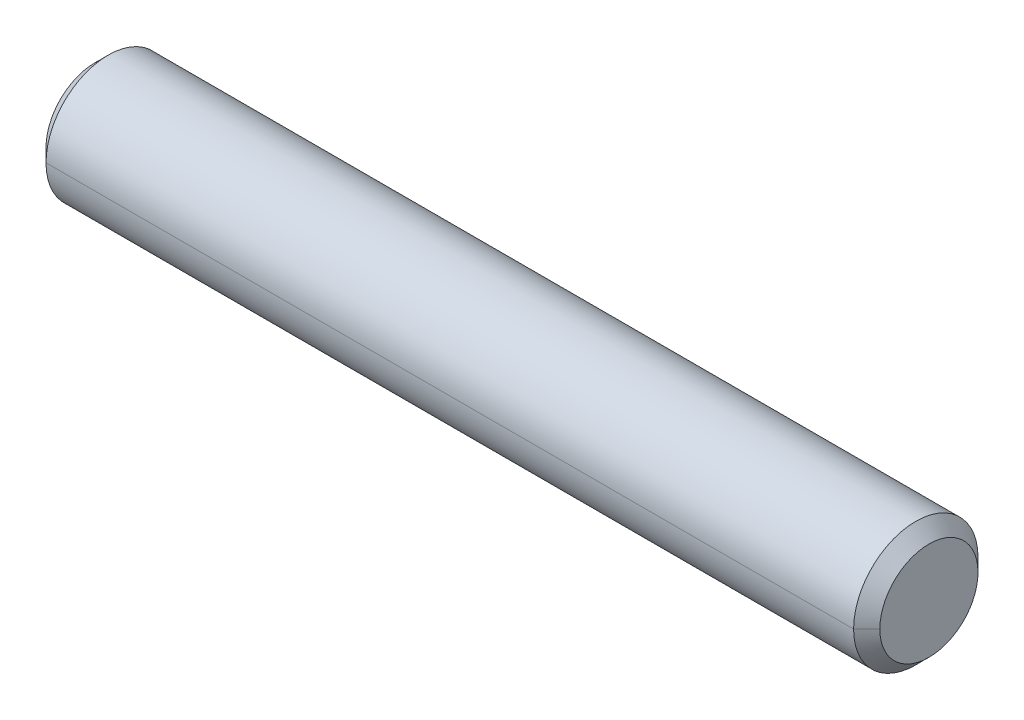
ISO-10303-21;
HEADER;
FILE_DESCRIPTION(('STEP AP214'),'2;1');
FILE_NAME('part.step','',(''),(''),'','','');
FILE_SCHEMA(('AUTOMOTIVE_DESIGN { 1 0 10303 214 1 1 1 1 }'));
ENDSEC;
DATA;
#1=APPLICATION_CONTEXT('core data for automotive mechanical design processes');
#2=APPLICATION_PROTOCOL_DEFINITION('international standard','automotive_design',2000,#1);
#3=PRODUCT_CONTEXT('',#1,'mechanical');
#4=PRODUCT('Part','Part','',(#3));
#5=PRODUCT_RELATED_PRODUCT_CATEGORY('part','',(#4));
#6=PRODUCT_DEFINITION_FORMATION('','',#4);
#7=PRODUCT_DEFINITION_CONTEXT('part definition',#1,'design');
#8=PRODUCT_DEFINITION('design','',#6,#7);
#9=PRODUCT_DEFINITION_SHAPE('','',#8);
#10=(LENGTH_UNIT() NAMED_UNIT(*) SI_UNIT(.MILLI.,.METRE.));
#11=(NAMED_UNIT(*) PLANE_ANGLE_UNIT() SI_UNIT($,.RADIAN.));
#12=(NAMED_UNIT(*) SI_UNIT($,.STERADIAN.) SOLID_ANGLE_UNIT());
#13=UNCERTAINTY_MEASURE_WITH_UNIT(LENGTH_MEASURE(1.E-05),#10,'distance_accuracy_value','');
#14=(GEOMETRIC_REPRESENTATION_CONTEXT(3) GLOBAL_UNCERTAINTY_ASSIGNED_CONTEXT((#13)) GLOBAL_UNIT_ASSIGNED_CONTEXT((#10,
#11,#12)) REPRESENTATION_CONTEXT('',''));
#15=CARTESIAN_POINT('',(0.,0.,0.));
#16=DIRECTION('',(0.,0.,1.));
#17=DIRECTION('',(1.,0.,0.));
#18=AXIS2_PLACEMENT_3D('',#15,#16,#17);
#19=CARTESIAN_POINT('',(15.875,0.,0.));
#20=DIRECTION('',(-1.,0.,0.));
#21=DIRECTION('',(0.,0.,1.));
#22=AXIS2_PLACEMENT_3D('',#19,#20,#21);
#23=CONICAL_SURFACE('',#22,1.86855,0.785398163397448);
#24=DIRECTION('',(-0.707106781186548,0.,-0.707106781186547));
#25=VECTOR('',#24,1.);
#26=CARTESIAN_POINT('',(15.875,0.,-1.86855));
#27=LINE('',#26,#25);
#28=CARTESIAN_POINT('',(15.875,0.,-1.86855));
#29=VERTEX_POINT('',#28);
#30=CARTESIAN_POINT('',(15.375,0.,-2.36855));
#31=VERTEX_POINT('',#30);
#32=EDGE_CURVE('E76',#29,#31,#27,.T.);
#33=ORIENTED_EDGE('',*,*,#32,.F.);
#34=CARTESIAN_POINT('',(15.875,0.,0.));
#35=DIRECTION('',(1.,0.,0.));
#36=DIRECTION('',(0.,0.,-1.));
#37=AXIS2_PLACEMENT_3D('',#34,#35,#36);
#38=CIRCLE('',#37,1.86855);
#39=CARTESIAN_POINT('',(15.875,0.,1.86855));
#40=VERTEX_POINT('',#39);
#41=EDGE_CURVE('E27',#40,#29,#38,.T.);
#42=ORIENTED_EDGE('',*,*,#41,.F.);
#43=DIRECTION('',(-0.707106781186548,0.,0.707106781186547));
#44=VECTOR('',#43,1.);
#45=CARTESIAN_POINT('',(15.875,0.,1.86855));
#46=LINE('',#45,#44);
#47=CARTESIAN_POINT('',(15.375,0.,2.36855));
#48=VERTEX_POINT('',#47);
#49=EDGE_CURVE('E20',#40,#48,#46,.T.);
#50=ORIENTED_EDGE('',*,*,#49,.T.);
#51=CARTESIAN_POINT('',(15.375,0.,0.));
#52=DIRECTION('',(-1.,0.,0.));
#53=DIRECTION('',(0.,0.,-1.));
#54=AXIS2_PLACEMENT_3D('',#51,#52,#53);
#55=CIRCLE('',#54,2.36855);
#56=EDGE_CURVE('E67',#31,#48,#55,.T.);
#57=ORIENTED_EDGE('',*,*,#56,.F.);
#58=EDGE_LOOP('',(#33,#42,#50,#57));
#59=FACE_BOUND('',#58,.T.);
#60=ADVANCED_FACE('F16',(#59),#23,.T.);
#61=CARTESIAN_POINT('',(-15.375,0.,0.));
#62=DIRECTION('',(1.,0.,0.));
#63=DIRECTION('',(0.,0.,-1.));
#64=AXIS2_PLACEMENT_3D('',#61,#62,#63);
#65=CONICAL_SURFACE('',#64,2.36855,0.785398163397455);
#66=DIRECTION('',(0.707106781186543,0.,0.707106781186552));
#67=VECTOR('',#66,1.);
#68=CARTESIAN_POINT('',(-15.375,0.,2.36855));
#69=LINE('',#68,#67);
#70=CARTESIAN_POINT('',(-15.875,0.,1.86855));
#71=VERTEX_POINT('',#70);
#72=CARTESIAN_POINT('',(-15.375,0.,2.36855));
#73=VERTEX_POINT('',#72);
#74=EDGE_CURVE('E108',#71,#73,#69,.T.);
#75=ORIENTED_EDGE('',*,*,#74,.F.);
#76=CARTESIAN_POINT('',(-15.875,0.,0.));
#77=DIRECTION('',(-1.,0.,0.));
#78=DIRECTION('',(0.,0.,-1.));
#79=AXIS2_PLACEMENT_3D('',#76,#77,#78);
#80=CIRCLE('',#79,1.86855);
#81=CARTESIAN_POINT('',(-15.875,0.,-1.86855));
#82=VERTEX_POINT('',#81);
#83=EDGE_CURVE('E11',#82,#71,#80,.T.);
#84=ORIENTED_EDGE('',*,*,#83,.F.);
#85=DIRECTION('',(0.707106781186543,0.,-0.707106781186552));
#86=VECTOR('',#85,1.);
#87=CARTESIAN_POINT('',(-15.375,0.,-2.36855));
#88=LINE('',#87,#86);
#89=CARTESIAN_POINT('',(-15.375,0.,-2.36855));
#90=VERTEX_POINT('',#89);
#91=EDGE_CURVE('E90',#82,#90,#88,.T.);
#92=ORIENTED_EDGE('',*,*,#91,.T.);
#93=CARTESIAN_POINT('',(-15.375,0.,0.));
#94=DIRECTION('',(1.,0.,0.));
#95=DIRECTION('',(0.,0.,-1.));
#96=AXIS2_PLACEMENT_3D('',#93,#94,#95);
#97=CIRCLE('',#96,2.36855);
#98=EDGE_CURVE('E41',#73,#90,#97,.T.);
#99=ORIENTED_EDGE('',*,*,#98,.F.);
#100=EDGE_LOOP('',(#75,#84,#92,#99));
#101=FACE_BOUND('',#100,.T.);
#102=ADVANCED_FACE('F133',(#101),#65,.T.);
#103=CARTESIAN_POINT('',(-15.875,0.,0.));
#104=DIRECTION('',(1.,0.,0.));
#105=DIRECTION('',(0.,1.,0.));
#106=AXIS2_PLACEMENT_3D('',#103,#104,#105);
#107=PLANE('',#106);
#108=ORIENTED_EDGE('',*,*,#83,.T.);
#109=CARTESIAN_POINT('',(-15.875,0.,0.));
#110=DIRECTION('',(-1.,0.,0.));
#111=DIRECTION('',(0.,0.,-1.));
#112=AXIS2_PLACEMENT_3D('',#109,#110,#111);
#113=CIRCLE('',#112,1.86855);
#114=EDGE_CURVE('E111',#71,#82,#113,.T.);
#115=ORIENTED_EDGE('',*,*,#114,.T.);
#116=EDGE_LOOP('',(#108,#115));
#117=FACE_BOUND('',#116,.T.);
#118=ADVANCED_FACE('F135',(#117),#107,.F.);
#119=CARTESIAN_POINT('',(15.875,0.,0.));
#120=DIRECTION('',(1.,0.,0.));
#121=DIRECTION('',(0.,1.,0.));
#122=AXIS2_PLACEMENT_3D('',#119,#120,#121);
#123=PLANE('',#122);
#124=ORIENTED_EDGE('',*,*,#41,.T.);
#125=CARTESIAN_POINT('',(15.875,0.,0.));
#126=DIRECTION('',(1.,0.,0.));
#127=DIRECTION('',(0.,0.,-1.));
#128=AXIS2_PLACEMENT_3D('',#125,#126,#127);
#129=CIRCLE('',#128,1.86855);
#130=EDGE_CURVE('E99',#29,#40,#129,.T.);
#131=ORIENTED_EDGE('',*,*,#130,.T.);
#132=EDGE_LOOP('',(#124,#131));
#133=FACE_BOUND('',#132,.T.);
#134=ADVANCED_FACE('F137',(#133),#123,.T.);
#135=CARTESIAN_POINT('',(15.875,0.,0.));
#136=DIRECTION('',(-1.,0.,0.));
#137=DIRECTION('',(0.,0.,1.));
#138=AXIS2_PLACEMENT_3D('',#135,#136,#137);
#139=CYLINDRICAL_SURFACE('',#138,2.36855);
#140=DIRECTION('',(-1.,0.,0.));
#141=VECTOR('',#140,1.);
#142=CARTESIAN_POINT('',(15.875,0.,-2.36855));
#143=LINE('',#142,#141);
#144=EDGE_CURVE('E83',#31,#90,#143,.T.);
#145=ORIENTED_EDGE('',*,*,#144,.F.);
#146=ORIENTED_EDGE('',*,*,#56,.T.);
#147=DIRECTION('',(-1.,0.,0.));
#148=VECTOR('',#147,1.);
#149=CARTESIAN_POINT('',(15.875,0.,2.36855));
#150=LINE('',#149,#148);
#151=EDGE_CURVE('E81',#48,#73,#150,.T.);
#152=ORIENTED_EDGE('',*,*,#151,.T.);
#153=ORIENTED_EDGE('',*,*,#98,.T.);
#154=EDGE_LOOP('',(#145,#146,#152,#153));
#155=FACE_BOUND('',#154,.T.);
#156=ADVANCED_FACE('F85',(#155),#139,.T.);
#157=CARTESIAN_POINT('',(15.875,0.,0.));
#158=DIRECTION('',(-1.,0.,0.));
#159=DIRECTION('',(0.,0.,1.));
#160=AXIS2_PLACEMENT_3D('',#157,#158,#159);
#161=CYLINDRICAL_SURFACE('',#160,2.36855);
#162=CARTESIAN_POINT('',(15.375,0.,0.));
#163=DIRECTION('',(-1.,0.,0.));
#164=DIRECTION('',(0.,0.,-1.));
#165=AXIS2_PLACEMENT_3D('',#162,#163,#164);
#166=CIRCLE('',#165,2.36855);
#167=EDGE_CURVE('E92',#48,#31,#166,.T.);
#168=ORIENTED_EDGE('',*,*,#167,.T.);
#169=ORIENTED_EDGE('',*,*,#144,.T.);
#170=CARTESIAN_POINT('',(-15.375,0.,0.));
#171=DIRECTION('',(1.,0.,0.));
#172=DIRECTION('',(0.,0.,-1.));
#173=AXIS2_PLACEMENT_3D('',#170,#171,#172);
#174=CIRCLE('',#173,2.36855);
#175=EDGE_CURVE('E110',#90,#73,#174,.T.);
#176=ORIENTED_EDGE('',*,*,#175,.T.);
#177=ORIENTED_EDGE('',*,*,#151,.F.);
#178=EDGE_LOOP('',(#168,#169,#176,#177));
#179=FACE_BOUND('',#178,.T.);
#180=ADVANCED_FACE('F93',(#179),#161,.T.);
#181=CARTESIAN_POINT('',(-15.375,0.,0.));
#182=DIRECTION('',(1.,0.,0.));
#183=DIRECTION('',(0.,0.,-1.));
#184=AXIS2_PLACEMENT_3D('',#181,#182,#183);
#185=CONICAL_SURFACE('',#184,2.36855,0.785398163397455);
#186=ORIENTED_EDGE('',*,*,#114,.F.);
#187=ORIENTED_EDGE('',*,*,#74,.T.);
#188=ORIENTED_EDGE('',*,*,#175,.F.);
#189=ORIENTED_EDGE('',*,*,#91,.F.);
#190=EDGE_LOOP('',(#186,#187,#188,#189));
#191=FACE_BOUND('',#190,.T.);
#192=ADVANCED_FACE('F18',(#191),#185,.T.);
#193=CARTESIAN_POINT('',(15.875,0.,0.));
#194=DIRECTION('',(-1.,0.,0.));
#195=DIRECTION('',(0.,0.,1.));
#196=AXIS2_PLACEMENT_3D('',#193,#194,#195);
#197=CONICAL_SURFACE('',#196,1.86855,0.785398163397448);
#198=ORIENTED_EDGE('',*,*,#130,.F.);
#199=ORIENTED_EDGE('',*,*,#32,.T.);
#200=ORIENTED_EDGE('',*,*,#167,.F.);
#201=ORIENTED_EDGE('',*,*,#49,.F.);
#202=EDGE_LOOP('',(#198,#199,#200,#201));
#203=FACE_BOUND('',#202,.T.);
#204=ADVANCED_FACE('F97',(#203),#197,.T.);
#205=CLOSED_SHELL('',(#60,#102,#118,#134,#156,#180,#192,#204));
#206=MANIFOLD_SOLID_BREP('B1',#205);
#207=ADVANCED_BREP_SHAPE_REPRESENTATION('',(#18,#206),#14);
#208=SHAPE_DEFINITION_REPRESENTATION(#9,#207);
ENDSEC;
END-ISO-10303-21;
